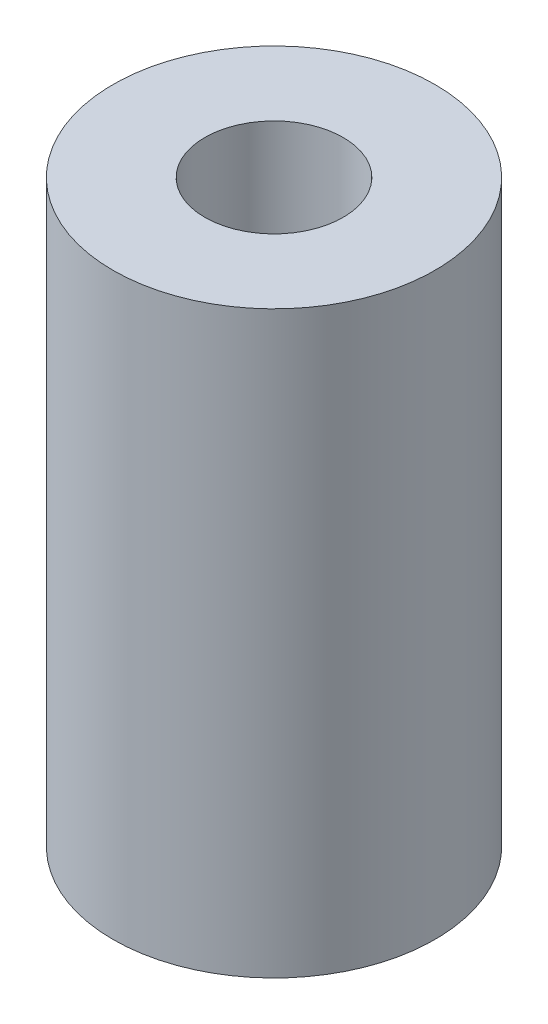
ISO-10303-21;
HEADER;
FILE_DESCRIPTION(('STEP AP214'),'2;1');
FILE_NAME('part.step','',(''),(''),'','','');
FILE_SCHEMA(('AUTOMOTIVE_DESIGN { 1 0 10303 214 1 1 1 1 }'));
ENDSEC;
DATA;
#1=APPLICATION_CONTEXT('core data for automotive mechanical design processes');
#2=APPLICATION_PROTOCOL_DEFINITION('international standard','automotive_design',2000,#1);
#3=PRODUCT_CONTEXT('',#1,'mechanical');
#4=PRODUCT('Part','Part','',(#3));
#5=PRODUCT_RELATED_PRODUCT_CATEGORY('part','',(#4));
#6=PRODUCT_DEFINITION_FORMATION('','',#4);
#7=PRODUCT_DEFINITION_CONTEXT('part definition',#1,'design');
#8=PRODUCT_DEFINITION('design','',#6,#7);
#9=PRODUCT_DEFINITION_SHAPE('','',#8);
#10=(LENGTH_UNIT() NAMED_UNIT(*) SI_UNIT(.MILLI.,.METRE.));
#11=(NAMED_UNIT(*) PLANE_ANGLE_UNIT() SI_UNIT($,.RADIAN.));
#12=(NAMED_UNIT(*) SI_UNIT($,.STERADIAN.) SOLID_ANGLE_UNIT());
#13=UNCERTAINTY_MEASURE_WITH_UNIT(LENGTH_MEASURE(1.E-05),#10,'distance_accuracy_value','');
#14=(GEOMETRIC_REPRESENTATION_CONTEXT(3) GLOBAL_UNCERTAINTY_ASSIGNED_CONTEXT((#13)) GLOBAL_UNIT_ASSIGNED_CONTEXT((#10,
#11,#12)) REPRESENTATION_CONTEXT('',''));
#15=CARTESIAN_POINT('',(0.,0.,0.));
#16=DIRECTION('',(0.,0.,1.));
#17=DIRECTION('',(1.,0.,0.));
#18=AXIS2_PLACEMENT_3D('',#15,#16,#17);
#19=CARTESIAN_POINT('',(0.,18.,0.));
#20=DIRECTION('',(0.,1.,0.));
#21=DIRECTION('',(0.,0.,1.));
#22=AXIS2_PLACEMENT_3D('',#19,#20,#21);
#23=PLANE('',#22);
#24=CARTESIAN_POINT('',(0.,18.,0.));
#25=DIRECTION('',(0.,1.,0.));
#26=DIRECTION('',(0.,0.,1.));
#27=AXIS2_PLACEMENT_3D('',#24,#25,#26);
#28=CIRCLE('',#27,5.);
#29=CARTESIAN_POINT('',(0.,18.,5.));
#30=VERTEX_POINT('',#29);
#31=EDGE_CURVE('E10',#30,#30,#28,.T.);
#32=ORIENTED_EDGE('',*,*,#31,.T.);
#33=EDGE_LOOP('',(#32));
#34=FACE_BOUND('',#33,.T.);
#35=CARTESIAN_POINT('',(0.,18.,0.));
#36=DIRECTION('',(0.,1.,0.));
#37=DIRECTION('',(0.,0.,1.));
#38=AXIS2_PLACEMENT_3D('',#35,#36,#37);
#39=CIRCLE('',#38,2.15);
#40=CARTESIAN_POINT('',(0.,18.,2.15));
#41=VERTEX_POINT('',#40);
#42=EDGE_CURVE('E44',#41,#41,#39,.T.);
#43=ORIENTED_EDGE('',*,*,#42,.F.);
#44=EDGE_LOOP('',(#43));
#45=FACE_BOUND('',#44,.T.);
#46=ADVANCED_FACE('F33',(#34,#45),#23,.T.);
#47=CARTESIAN_POINT('',(0.,0.,0.));
#48=DIRECTION('',(0.,1.,0.));
#49=DIRECTION('',(0.,0.,1.));
#50=AXIS2_PLACEMENT_3D('',#47,#48,#49);
#51=PLANE('',#50);
#52=CARTESIAN_POINT('',(0.,0.,0.));
#53=DIRECTION('',(0.,1.,0.));
#54=DIRECTION('',(0.,0.,1.));
#55=AXIS2_PLACEMENT_3D('',#52,#53,#54);
#56=CIRCLE('',#55,5.);
#57=CARTESIAN_POINT('',(0.,0.,5.));
#58=VERTEX_POINT('',#57);
#59=EDGE_CURVE('E37',#58,#58,#56,.T.);
#60=ORIENTED_EDGE('',*,*,#59,.F.);
#61=EDGE_LOOP('',(#60));
#62=FACE_BOUND('',#61,.T.);
#63=CARTESIAN_POINT('',(0.,0.,0.));
#64=DIRECTION('',(0.,1.,0.));
#65=DIRECTION('',(0.,0.,1.));
#66=AXIS2_PLACEMENT_3D('',#63,#64,#65);
#67=CIRCLE('',#66,2.15);
#68=CARTESIAN_POINT('',(0.,0.,2.15));
#69=VERTEX_POINT('',#68);
#70=EDGE_CURVE('E46',#69,#69,#67,.T.);
#71=ORIENTED_EDGE('',*,*,#70,.T.);
#72=EDGE_LOOP('',(#71));
#73=FACE_BOUND('',#72,.T.);
#74=ADVANCED_FACE('F56',(#62,#73),#51,.F.);
#75=CARTESIAN_POINT('',(0.,18.,0.));
#76=DIRECTION('',(0.,-1.,0.));
#77=DIRECTION('',(0.,0.,-1.));
#78=AXIS2_PLACEMENT_3D('',#75,#76,#77);
#79=CYLINDRICAL_SURFACE('',#78,5.);
#80=ORIENTED_EDGE('',*,*,#31,.F.);
#81=EDGE_LOOP('',(#80));
#82=FACE_BOUND('',#81,.T.);
#83=ORIENTED_EDGE('',*,*,#59,.T.);
#84=EDGE_LOOP('',(#83));
#85=FACE_BOUND('',#84,.T.);
#86=ADVANCED_FACE('F35',(#82,#85),#79,.T.);
#87=CARTESIAN_POINT('',(0.,18.,0.));
#88=DIRECTION('',(0.,-1.,0.));
#89=DIRECTION('',(0.,0.,-1.));
#90=AXIS2_PLACEMENT_3D('',#87,#88,#89);
#91=CYLINDRICAL_SURFACE('',#90,2.15);
#92=ORIENTED_EDGE('',*,*,#42,.T.);
#93=EDGE_LOOP('',(#92));
#94=FACE_BOUND('',#93,.T.);
#95=ORIENTED_EDGE('',*,*,#70,.F.);
#96=EDGE_LOOP('',(#95));
#97=FACE_BOUND('',#96,.T.);
#98=ADVANCED_FACE('F52',(#94,#97),#91,.F.);
#99=CLOSED_SHELL('',(#46,#74,#86,#98));
#100=MANIFOLD_SOLID_BREP('B2',#99);
#101=ADVANCED_BREP_SHAPE_REPRESENTATION('',(#18,#100),#14);
#102=SHAPE_DEFINITION_REPRESENTATION(#9,#101);
ENDSEC;
END-ISO-10303-21;
